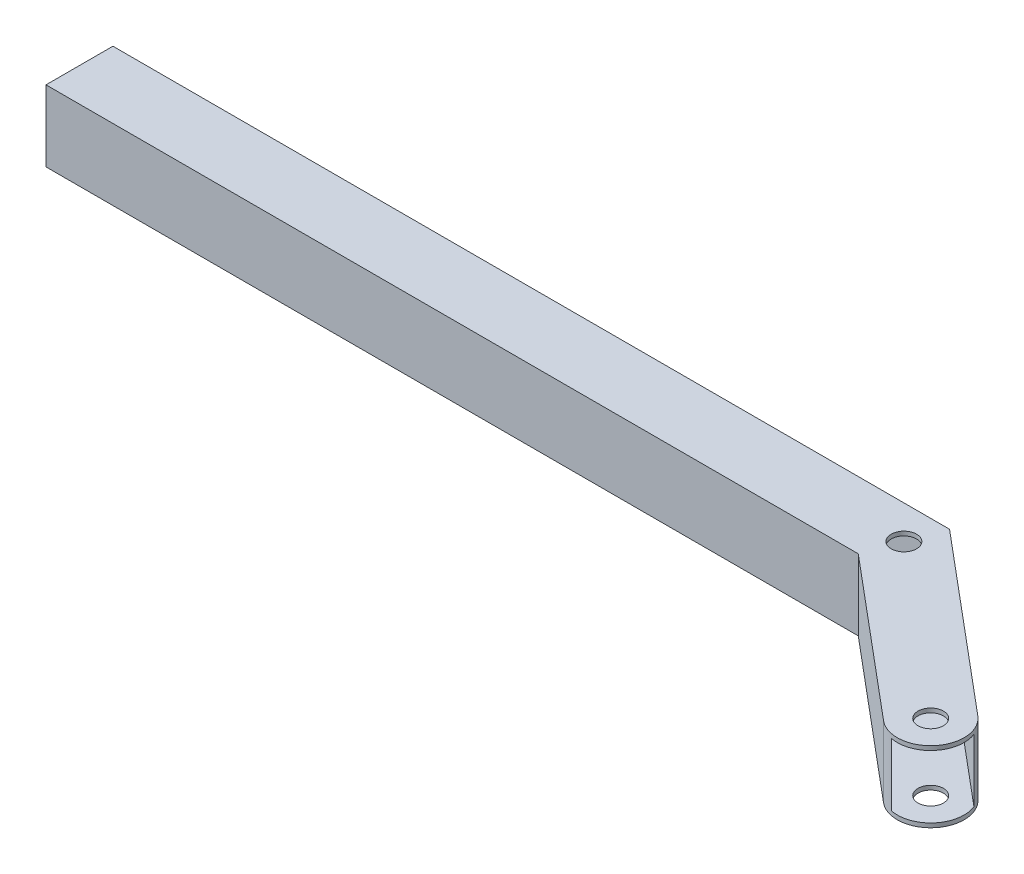
ISO-10303-21;
HEADER;
FILE_DESCRIPTION(('STEP AP214'),'2;1');
FILE_NAME('part.step','',(''),(''),'','','');
FILE_SCHEMA(('AUTOMOTIVE_DESIGN { 1 0 10303 214 1 1 1 1 }'));
ENDSEC;
DATA;
#1=APPLICATION_CONTEXT('core data for automotive mechanical design processes');
#2=APPLICATION_PROTOCOL_DEFINITION('international standard','automotive_design',2000,#1);
#3=PRODUCT_CONTEXT('',#1,'mechanical');
#4=PRODUCT('Part','Part','',(#3));
#5=PRODUCT_RELATED_PRODUCT_CATEGORY('part','',(#4));
#6=PRODUCT_DEFINITION_FORMATION('','',#4);
#7=PRODUCT_DEFINITION_CONTEXT('part definition',#1,'design');
#8=PRODUCT_DEFINITION('design','',#6,#7);
#9=PRODUCT_DEFINITION_SHAPE('','',#8);
#10=(LENGTH_UNIT() NAMED_UNIT(*) SI_UNIT(.MILLI.,.METRE.));
#11=(NAMED_UNIT(*) PLANE_ANGLE_UNIT() SI_UNIT($,.RADIAN.));
#12=(NAMED_UNIT(*) SI_UNIT($,.STERADIAN.) SOLID_ANGLE_UNIT());
#13=UNCERTAINTY_MEASURE_WITH_UNIT(LENGTH_MEASURE(1.E-05),#10,'distance_accuracy_value','');
#14=(GEOMETRIC_REPRESENTATION_CONTEXT(3) GLOBAL_UNCERTAINTY_ASSIGNED_CONTEXT((#13)) GLOBAL_UNIT_ASSIGNED_CONTEXT((#10,
#11,#12)) REPRESENTATION_CONTEXT('',''));
#15=CARTESIAN_POINT('',(0.,0.,0.));
#16=DIRECTION('',(0.,0.,1.));
#17=DIRECTION('',(1.,0.,0.));
#18=AXIS2_PLACEMENT_3D('',#15,#16,#17);
#19=CARTESIAN_POINT('',(175.75389828308,1.5875,92.7553970020009));
#20=DIRECTION('',(0.,-1.,0.));
#21=DIRECTION('',(0.,0.,-1.));
#22=AXIS2_PLACEMENT_3D('',#19,#20,#21);
#23=PLANE('',#22);
#24=CARTESIAN_POINT('',(175.75389828308,1.5875,92.7553970020009));
#25=DIRECTION('',(0.,-1.,0.));
#26=DIRECTION('',(0.,0.,-1.));
#27=AXIS2_PLACEMENT_3D('',#24,#25,#26);
#28=CIRCLE('',#27,4.82599999999999);
#29=CARTESIAN_POINT('',(175.75389828308,1.5875,87.9293970020009));
#30=VERTEX_POINT('',#29);
#31=EDGE_CURVE('E315',#30,#30,#28,.T.);
#32=ORIENTED_EDGE('',*,*,#31,.T.);
#33=EDGE_LOOP('',(#32));
#34=FACE_BOUND('',#33,.T.);
#35=CARTESIAN_POINT('',(112.516929503608,1.5875,39.6932798223774));
#36=DIRECTION('',(0.,-1.,0.));
#37=DIRECTION('',(0.,0.,-1.));
#38=AXIS2_PLACEMENT_3D('',#35,#36,#37);
#39=CIRCLE('',#38,4.82599999999999);
#40=CARTESIAN_POINT('',(112.516929503608,1.5875,34.8672798223774));
#41=VERTEX_POINT('',#40);
#42=EDGE_CURVE('E297',#41,#41,#39,.T.);
#43=ORIENTED_EDGE('',*,*,#42,.T.);
#44=EDGE_LOOP('',(#43));
#45=FACE_BOUND('',#44,.T.);
#46=DIRECTION('',(-0.766044443118982,0.,-0.642787609686534));
#47=VECTOR('',#46,1.);
#48=CARTESIAN_POINT('',(108.472310275325,1.5875,50.8057798223774));
#49=LINE('',#48,#47);
#50=CARTESIAN_POINT('',(173.320838796353,1.5875,105.22015618676));
#51=VERTEX_POINT('',#50);
#52=CARTESIAN_POINT('',(108.472310275325,1.5875,50.8057798223774));
#53=VERTEX_POINT('',#52);
#54=EDGE_CURVE('E344',#51,#53,#49,.T.);
#55=ORIENTED_EDGE('',*,*,#54,.F.);
#56=CARTESIAN_POINT('',(175.75389828308,1.5875,92.7553970020009));
#57=DIRECTION('',(0.,1.,0.));
#58=DIRECTION('',(0.,0.,-1.));
#59=AXIS2_PLACEMENT_3D('',#56,#57,#58);
#60=CIRCLE('',#59,12.7000000000001);
#61=CARTESIAN_POINT('',(187.606793421632,1.5875,88.1948184384306));
#62=VERTEX_POINT('',#61);
#63=EDGE_CURVE('E173',#51,#62,#60,.T.);
#64=ORIENTED_EDGE('',*,*,#63,.T.);
#65=DIRECTION('',(0.766044443119019,0.,0.642787609686491));
#66=VECTOR('',#65,1.);
#67=CARTESIAN_POINT('',(187.606793421639,1.5875,88.1948184384368));
#68=LINE('',#67,#66);
#69=CARTESIAN_POINT('',(117.139351478789,1.5875,29.0656138941922));
#70=VERTEX_POINT('',#69);
#71=EDGE_CURVE('E191',#70,#62,#68,.T.);
#72=ORIENTED_EDGE('',*,*,#71,.F.);
#73=DIRECTION('',(0.,0.,1.));
#74=VECTOR('',#73,1.);
#75=CARTESIAN_POINT('',(117.139351478789,1.5875,29.0656138941922));
#76=LINE('',#75,#74);
#77=CARTESIAN_POINT('',(117.139351478789,1.5875,28.5807798223774));
#78=VERTEX_POINT('',#77);
#79=EDGE_CURVE('E214',#78,#70,#76,.T.);
#80=ORIENTED_EDGE('',*,*,#79,.F.);
#81=DIRECTION('',(1.,0.,0.));
#82=VECTOR('',#81,1.);
#83=CARTESIAN_POINT('',(117.139351478789,1.5875,28.5807798223774));
#84=LINE('',#83,#82);
#85=CARTESIAN_POINT('',(116.561548731891,1.5875,28.5807798223774));
#86=VERTEX_POINT('',#85);
#87=EDGE_CURVE('E210',#86,#78,#84,.T.);
#88=ORIENTED_EDGE('',*,*,#87,.F.);
#89=DIRECTION('',(0.766044443119018,0.,0.642787609686491));
#90=VECTOR('',#89,1.);
#91=CARTESIAN_POINT('',(116.561548731891,1.5875,28.5807798223774));
#92=LINE('',#91,#90);
#93=CARTESIAN_POINT('',(116.118926148411,1.5875,28.2093753758287));
#94=VERTEX_POINT('',#93);
#95=EDGE_CURVE('E206',#94,#86,#92,.T.);
#96=ORIENTED_EDGE('',*,*,#95,.F.);
#97=DIRECTION('',(0.642787609686489,0.,-0.76604444311902));
#98=VECTOR('',#97,1.);
#99=CARTESIAN_POINT('',(116.118926148411,1.5875,28.2093753758287));
#100=LINE('',#99,#98);
#101=CARTESIAN_POINT('',(115.807280814295,1.5875,28.5807798223774));
#102=VERTEX_POINT('',#101);
#103=EDGE_CURVE('E180',#102,#94,#100,.T.);
#104=ORIENTED_EDGE('',*,*,#103,.F.);
#105=DIRECTION('',(1.,0.,0.));
#106=VECTOR('',#105,1.);
#107=CARTESIAN_POINT('',(115.807280814295,1.5875,28.5807798223774));
#108=LINE('',#107,#106);
#109=CARTESIAN_POINT('',(-200.411070496392,1.5875,28.5807798223775));
#110=VERTEX_POINT('',#109);
#111=EDGE_CURVE('E175',#110,#102,#108,.T.);
#112=ORIENTED_EDGE('',*,*,#111,.F.);
#113=DIRECTION('',(0.,0.,1.));
#114=VECTOR('',#113,1.);
#115=CARTESIAN_POINT('',(-200.411070496392,1.5875,52.3932798223774));
#116=LINE('',#115,#114);
#117=CARTESIAN_POINT('',(-200.411070496392,1.5875,50.8057798223774));
#118=VERTEX_POINT('',#117);
#119=EDGE_CURVE('E244',#110,#118,#116,.T.);
#120=ORIENTED_EDGE('',*,*,#119,.T.);
#121=DIRECTION('',(-1.,0.,0.));
#122=VECTOR('',#121,1.);
#123=CARTESIAN_POINT('',(-200.411070496392,1.5875,50.8057798223774));
#124=LINE('',#123,#122);
#125=EDGE_CURVE('E350',#53,#118,#124,.T.);
#126=ORIENTED_EDGE('',*,*,#125,.F.);
#127=EDGE_LOOP('',(#55,#64,#72,#80,#88,#96,#104,#112,#120,#126));
#128=FACE_BOUND('',#127,.T.);
#129=ADVANCED_FACE('F39',(#34,#45,#128),#23,.F.);
#130=CARTESIAN_POINT('',(175.75389828308,1.5875,92.7553970020009));
#131=DIRECTION('',(0.,-1.,0.));
#132=DIRECTION('',(0.,0.,-1.));
#133=AXIS2_PLACEMENT_3D('',#130,#131,#132);
#134=CYLINDRICAL_SURFACE('',#133,12.7000000000001);
#135=CARTESIAN_POINT('',(175.75389828308,25.4,92.7553970020008));
#136=DIRECTION('',(0.,1.,0.));
#137=DIRECTION('',(0.,0.,-1.));
#138=AXIS2_PLACEMENT_3D('',#135,#136,#137);
#139=CIRCLE('',#138,12.7000000000001);
#140=CARTESIAN_POINT('',(173.320838796353,25.4,105.22015618676));
#141=VERTEX_POINT('',#140);
#142=CARTESIAN_POINT('',(187.606793421632,25.4,88.1948184384308));
#143=VERTEX_POINT('',#142);
#144=EDGE_CURVE('E157',#141,#143,#139,.T.);
#145=ORIENTED_EDGE('',*,*,#144,.T.);
#146=DIRECTION('',(0.,-1.,0.));
#147=VECTOR('',#146,1.);
#148=CARTESIAN_POINT('',(187.606793421639,26.9875,88.1948184384368));
#149=LINE('',#148,#147);
#150=EDGE_CURVE('E201',#143,#62,#149,.T.);
#151=ORIENTED_EDGE('',*,*,#150,.T.);
#152=ORIENTED_EDGE('',*,*,#63,.F.);
#153=DIRECTION('',(0.,-1.,0.));
#154=VECTOR('',#153,1.);
#155=CARTESIAN_POINT('',(173.320838796353,26.9875,105.22015618676));
#156=LINE('',#155,#154);
#157=EDGE_CURVE('E64',#141,#51,#156,.T.);
#158=ORIENTED_EDGE('',*,*,#157,.F.);
#159=EDGE_LOOP('',(#145,#151,#152,#158));
#160=FACE_BOUND('',#159,.T.);
#161=CARTESIAN_POINT('',(175.75389828308,0.,92.7553970020009));
#162=DIRECTION('',(0.,1.,0.));
#163=DIRECTION('',(0.,0.,-1.));
#164=AXIS2_PLACEMENT_3D('',#161,#162,#163);
#165=CIRCLE('',#164,12.7000000000001);
#166=CARTESIAN_POINT('',(167.590495640061,0.,102.484161429612));
#167=VERTEX_POINT('',#166);
#168=CARTESIAN_POINT('',(183.917300926099,0.,83.0266325743897));
#169=VERTEX_POINT('',#168);
#170=EDGE_CURVE('E241',#167,#169,#165,.T.);
#171=ORIENTED_EDGE('',*,*,#170,.T.);
#172=DIRECTION('',(0.,-1.,0.));
#173=VECTOR('',#172,1.);
#174=CARTESIAN_POINT('',(183.917300926099,1.5875,83.0266325743897));
#175=LINE('',#174,#173);
#176=CARTESIAN_POINT('',(183.917300926102,26.9875,83.026632574386));
#177=VERTEX_POINT('',#176);
#178=EDGE_CURVE('E49',#177,#169,#175,.T.);
#179=ORIENTED_EDGE('',*,*,#178,.F.);
#180=CARTESIAN_POINT('',(175.753898283083,26.9875,92.755397001998));
#181=DIRECTION('',(0.,1.,0.));
#182=DIRECTION('',(0.,0.,-1.));
#183=AXIS2_PLACEMENT_3D('',#180,#181,#182);
#184=CIRCLE('',#183,12.7000000000007);
#185=CARTESIAN_POINT('',(167.590495640061,26.9875,102.484161429612));
#186=VERTEX_POINT('',#185);
#187=EDGE_CURVE('E186',#186,#177,#184,.T.);
#188=ORIENTED_EDGE('',*,*,#187,.F.);
#189=DIRECTION('',(0.,-1.,0.));
#190=VECTOR('',#189,1.);
#191=CARTESIAN_POINT('',(167.590495640061,1.5875,102.484161429612));
#192=LINE('',#191,#190);
#193=EDGE_CURVE('E249',#186,#167,#192,.T.);
#194=ORIENTED_EDGE('',*,*,#193,.T.);
#195=EDGE_LOOP('',(#171,#179,#188,#194));
#196=FACE_BOUND('',#195,.T.);
#197=ADVANCED_FACE('F41',(#160,#196),#134,.T.);
#198=CARTESIAN_POINT('',(117.139351478789,1.5875,26.9932798223774));
#199=DIRECTION('',(-0.642787609686534,0.,0.766044443118982));
#200=DIRECTION('',(0.766044443118983,0.,0.642787609686534));
#201=AXIS2_PLACEMENT_3D('',#198,#199,#200);
#202=PLANE('',#201);
#203=DIRECTION('',(-0.766044443118983,0.,-0.642787609686534));
#204=VECTOR('',#203,1.);
#205=CARTESIAN_POINT('',(117.139351478789,0.,26.9932798223774));
#206=LINE('',#205,#204);
#207=CARTESIAN_POINT('',(117.139351478789,0.,26.9932798223774));
#208=VERTEX_POINT('',#207);
#209=EDGE_CURVE('E253',#169,#208,#206,.T.);
#210=ORIENTED_EDGE('',*,*,#209,.T.);
#211=DIRECTION('',(0.,-1.,0.));
#212=VECTOR('',#211,1.);
#213=CARTESIAN_POINT('',(117.139351478789,1.5875,26.9932798223774));
#214=LINE('',#213,#212);
#215=CARTESIAN_POINT('',(117.139351478789,26.9875,26.9932798223774));
#216=VERTEX_POINT('',#215);
#217=EDGE_CURVE('E283',#216,#208,#214,.T.);
#218=ORIENTED_EDGE('',*,*,#217,.F.);
#219=DIRECTION('',(-0.766044443119019,0.,-0.642787609686491));
#220=VECTOR('',#219,1.);
#221=CARTESIAN_POINT('',(117.139351478789,26.9875,26.9932798223774));
#222=LINE('',#221,#220);
#223=EDGE_CURVE('E190',#177,#216,#222,.T.);
#224=ORIENTED_EDGE('',*,*,#223,.F.);
#225=ORIENTED_EDGE('',*,*,#178,.T.);
#226=EDGE_LOOP('',(#210,#218,#224,#225));
#227=FACE_BOUND('',#226,.T.);
#228=ADVANCED_FACE('F385',(#227),#202,.F.);
#229=CARTESIAN_POINT('',(-200.411070496392,1.5875,26.9932798223774));
#230=DIRECTION('',(0.,0.,1.));
#231=DIRECTION('',(1.,0.,0.));
#232=AXIS2_PLACEMENT_3D('',#229,#230,#231);
#233=PLANE('',#232);
#234=DIRECTION('',(-1.,0.,0.));
#235=VECTOR('',#234,1.);
#236=CARTESIAN_POINT('',(-200.411070496392,0.,26.9932798223774));
#237=LINE('',#236,#235);
#238=CARTESIAN_POINT('',(-200.411070496392,0.,26.9932798223774));
#239=VERTEX_POINT('',#238);
#240=EDGE_CURVE('E257',#208,#239,#237,.T.);
#241=ORIENTED_EDGE('',*,*,#240,.T.);
#242=DIRECTION('',(0.,-1.,0.));
#243=VECTOR('',#242,1.);
#244=CARTESIAN_POINT('',(-200.411070496392,1.5875,26.9932798223774));
#245=LINE('',#244,#243);
#246=CARTESIAN_POINT('',(-200.411070496392,26.9875,26.9932798223774));
#247=VERTEX_POINT('',#246);
#248=EDGE_CURVE('E280',#247,#239,#245,.T.);
#249=ORIENTED_EDGE('',*,*,#248,.F.);
#250=DIRECTION('',(-1.,0.,0.));
#251=VECTOR('',#250,1.);
#252=CARTESIAN_POINT('',(-200.411070496392,26.9875,26.9932798223774));
#253=LINE('',#252,#251);
#254=EDGE_CURVE('E195',#216,#247,#253,.T.);
#255=ORIENTED_EDGE('',*,*,#254,.F.);
#256=ORIENTED_EDGE('',*,*,#217,.T.);
#257=EDGE_LOOP('',(#241,#249,#255,#256));
#258=FACE_BOUND('',#257,.T.);
#259=ADVANCED_FACE('F405',(#258),#233,.F.);
#260=CARTESIAN_POINT('',(-200.411070496392,1.5875,52.3932798223774));
#261=DIRECTION('',(1.,0.,0.));
#262=DIRECTION('',(0.,0.,-1.));
#263=AXIS2_PLACEMENT_3D('',#260,#261,#262);
#264=PLANE('',#263);
#265=DIRECTION('',(0.,0.,1.));
#266=VECTOR('',#265,1.);
#267=CARTESIAN_POINT('',(-200.411070496392,25.4,26.9932798223774));
#268=LINE('',#267,#266);
#269=CARTESIAN_POINT('',(-200.411070496392,25.4,28.5807798223775));
#270=VERTEX_POINT('',#269);
#271=CARTESIAN_POINT('',(-200.411070496392,25.4,50.8057798223774));
#272=VERTEX_POINT('',#271);
#273=EDGE_CURVE('E165',#270,#272,#268,.T.);
#274=ORIENTED_EDGE('',*,*,#273,.T.);
#275=DIRECTION('',(0.,-1.,0.));
#276=VECTOR('',#275,1.);
#277=CARTESIAN_POINT('',(-200.411070496392,26.9875,50.8057798223774));
#278=LINE('',#277,#276);
#279=EDGE_CURVE('E182',#272,#118,#278,.T.);
#280=ORIENTED_EDGE('',*,*,#279,.T.);
#281=ORIENTED_EDGE('',*,*,#119,.F.);
#282=DIRECTION('',(0.,-1.,0.));
#283=VECTOR('',#282,1.);
#284=CARTESIAN_POINT('',(-200.411070496392,26.9875,28.5807798223775));
#285=LINE('',#284,#283);
#286=EDGE_CURVE('E238',#270,#110,#285,.T.);
#287=ORIENTED_EDGE('',*,*,#286,.F.);
#288=EDGE_LOOP('',(#274,#280,#281,#287));
#289=FACE_BOUND('',#288,.T.);
#290=DIRECTION('',(0.,0.,1.));
#291=VECTOR('',#290,1.);
#292=CARTESIAN_POINT('',(-200.411070496392,0.,52.3932798223774));
#293=LINE('',#292,#291);
#294=CARTESIAN_POINT('',(-200.411070496392,0.,52.3932798223774));
#295=VERTEX_POINT('',#294);
#296=EDGE_CURVE('E261',#239,#295,#293,.T.);
#297=ORIENTED_EDGE('',*,*,#296,.T.);
#298=DIRECTION('',(0.,-1.,0.));
#299=VECTOR('',#298,1.);
#300=CARTESIAN_POINT('',(-200.411070496392,1.5875,52.3932798223774));
#301=LINE('',#300,#299);
#302=CARTESIAN_POINT('',(-200.411070496392,26.9875,52.3932798223774));
#303=VERTEX_POINT('',#302);
#304=EDGE_CURVE('E277',#303,#295,#301,.T.);
#305=ORIENTED_EDGE('',*,*,#304,.F.);
#306=DIRECTION('',(0.,0.,1.));
#307=VECTOR('',#306,1.);
#308=CARTESIAN_POINT('',(-200.411070496392,26.9875,28.5807798223775));
#309=LINE('',#308,#307);
#310=EDGE_CURVE('E199',#247,#303,#309,.T.);
#311=ORIENTED_EDGE('',*,*,#310,.F.);
#312=ORIENTED_EDGE('',*,*,#248,.T.);
#313=EDGE_LOOP('',(#297,#305,#311,#312));
#314=FACE_BOUND('',#313,.T.);
#315=ADVANCED_FACE('F361',(#289,#314),#264,.F.);
#316=CARTESIAN_POINT('',(107.894507528427,1.5875,52.3932798223774));
#317=DIRECTION('',(0.,0.,-1.));
#318=DIRECTION('',(-1.,0.,0.));
#319=AXIS2_PLACEMENT_3D('',#316,#317,#318);
#320=PLANE('',#319);
#321=DIRECTION('',(1.,0.,0.));
#322=VECTOR('',#321,1.);
#323=CARTESIAN_POINT('',(107.894507528427,0.,52.3932798223774));
#324=LINE('',#323,#322);
#325=CARTESIAN_POINT('',(107.894507528427,0.,52.3932798223774));
#326=VERTEX_POINT('',#325);
#327=EDGE_CURVE('E265',#295,#326,#324,.T.);
#328=ORIENTED_EDGE('',*,*,#327,.T.);
#329=DIRECTION('',(0.,-1.,0.));
#330=VECTOR('',#329,1.);
#331=CARTESIAN_POINT('',(107.894507528427,1.5875,52.3932798223774));
#332=LINE('',#331,#330);
#333=CARTESIAN_POINT('',(107.894507528427,26.9875,52.3932798223774));
#334=VERTEX_POINT('',#333);
#335=EDGE_CURVE('E274',#334,#326,#332,.T.);
#336=ORIENTED_EDGE('',*,*,#335,.F.);
#337=DIRECTION('',(1.,0.,0.));
#338=VECTOR('',#337,1.);
#339=CARTESIAN_POINT('',(107.894507528427,26.9875,52.3932798223774));
#340=LINE('',#339,#338);
#341=EDGE_CURVE('E345',#303,#334,#340,.T.);
#342=ORIENTED_EDGE('',*,*,#341,.F.);
#343=ORIENTED_EDGE('',*,*,#304,.T.);
#344=EDGE_LOOP('',(#328,#336,#342,#343));
#345=FACE_BOUND('',#344,.T.);
#346=ADVANCED_FACE('F398',(#345),#320,.F.);
#347=CARTESIAN_POINT('',(167.590495640061,1.5875,102.484161429612));
#348=DIRECTION('',(0.642787609686536,0.,-0.766044443118981));
#349=DIRECTION('',(-0.766044443118981,0.,-0.642787609686536));
#350=AXIS2_PLACEMENT_3D('',#347,#348,#349);
#351=PLANE('',#350);
#352=DIRECTION('',(0.766044443118981,0.,0.642787609686536));
#353=VECTOR('',#352,1.);
#354=CARTESIAN_POINT('',(167.590495640061,0.,102.484161429612));
#355=LINE('',#354,#353);
#356=EDGE_CURVE('E245',#326,#167,#355,.T.);
#357=ORIENTED_EDGE('',*,*,#356,.T.);
#358=ORIENTED_EDGE('',*,*,#193,.F.);
#359=DIRECTION('',(0.766044443118981,0.,0.642787609686535));
#360=VECTOR('',#359,1.);
#361=CARTESIAN_POINT('',(167.590495640061,26.9875,102.484161429612));
#362=LINE('',#361,#360);
#363=EDGE_CURVE('E349',#334,#186,#362,.T.);
#364=ORIENTED_EDGE('',*,*,#363,.F.);
#365=ORIENTED_EDGE('',*,*,#335,.T.);
#366=EDGE_LOOP('',(#357,#358,#364,#365));
#367=FACE_BOUND('',#366,.T.);
#368=ADVANCED_FACE('F394',(#367),#351,.F.);
#369=CARTESIAN_POINT('',(175.75389828308,0.,92.7553970020009));
#370=DIRECTION('',(0.,-1.,0.));
#371=DIRECTION('',(0.,0.,-1.));
#372=AXIS2_PLACEMENT_3D('',#369,#370,#371);
#373=PLANE('',#372);
#374=CARTESIAN_POINT('',(175.75389828308,0.,92.7553970020009));
#375=DIRECTION('',(0.,-1.,0.));
#376=DIRECTION('',(0.,0.,-1.));
#377=AXIS2_PLACEMENT_3D('',#374,#375,#376);
#378=CIRCLE('',#377,4.82599999999999);
#379=CARTESIAN_POINT('',(175.75389828308,0.,87.9293970020009));
#380=VERTEX_POINT('',#379);
#381=EDGE_CURVE('E311',#380,#380,#378,.T.);
#382=ORIENTED_EDGE('',*,*,#381,.F.);
#383=EDGE_LOOP('',(#382));
#384=FACE_BOUND('',#383,.T.);
#385=CARTESIAN_POINT('',(112.516929503608,0.,39.6932798223774));
#386=DIRECTION('',(0.,-1.,0.));
#387=DIRECTION('',(0.,0.,-1.));
#388=AXIS2_PLACEMENT_3D('',#385,#386,#387);
#389=CIRCLE('',#388,4.82599999999999);
#390=CARTESIAN_POINT('',(112.516929503608,0.,34.8672798223774));
#391=VERTEX_POINT('',#390);
#392=EDGE_CURVE('E290',#391,#391,#389,.T.);
#393=ORIENTED_EDGE('',*,*,#392,.F.);
#394=EDGE_LOOP('',(#393));
#395=FACE_BOUND('',#394,.T.);
#396=ORIENTED_EDGE('',*,*,#170,.F.);
#397=ORIENTED_EDGE('',*,*,#356,.F.);
#398=ORIENTED_EDGE('',*,*,#327,.F.);
#399=ORIENTED_EDGE('',*,*,#296,.F.);
#400=ORIENTED_EDGE('',*,*,#240,.F.);
#401=ORIENTED_EDGE('',*,*,#209,.F.);
#402=EDGE_LOOP('',(#396,#397,#398,#399,#400,#401));
#403=FACE_BOUND('',#402,.T.);
#404=ADVANCED_FACE('F391',(#384,#395,#403),#373,.T.);
#405=CARTESIAN_POINT('',(115.807280814295,26.9875,28.5807798223774));
#406=DIRECTION('',(0.,0.,-1.));
#407=DIRECTION('',(-1.,0.,0.));
#408=AXIS2_PLACEMENT_3D('',#405,#406,#407);
#409=PLANE('',#408);
#410=DIRECTION('',(0.,-1.,0.));
#411=VECTOR('',#410,1.);
#412=CARTESIAN_POINT('',(115.807280814295,26.9875,28.5807798223774));
#413=LINE('',#412,#411);
#414=CARTESIAN_POINT('',(115.807280814295,25.4,28.5807798223774));
#415=VERTEX_POINT('',#414);
#416=EDGE_CURVE('E235',#415,#102,#413,.T.);
#417=ORIENTED_EDGE('',*,*,#416,.F.);
#418=DIRECTION('',(-1.,0.,0.));
#419=VECTOR('',#418,1.);
#420=CARTESIAN_POINT('',(115.807280814295,25.4,28.5807798223774));
#421=LINE('',#420,#419);
#422=EDGE_CURVE('E340',#415,#270,#421,.T.);
#423=ORIENTED_EDGE('',*,*,#422,.T.);
#424=ORIENTED_EDGE('',*,*,#286,.T.);
#425=ORIENTED_EDGE('',*,*,#111,.T.);
#426=EDGE_LOOP('',(#417,#423,#424,#425));
#427=FACE_BOUND('',#426,.T.);
#428=ADVANCED_FACE('F389',(#427),#409,.F.);
#429=CARTESIAN_POINT('',(116.118926148411,26.9875,28.2093753758287));
#430=DIRECTION('',(-0.76604444311902,0.,-0.642787609686489));
#431=DIRECTION('',(-0.64278760968649,0.,0.76604444311902));
#432=AXIS2_PLACEMENT_3D('',#429,#430,#431);
#433=PLANE('',#432);
#434=DIRECTION('',(0.,-1.,0.));
#435=VECTOR('',#434,1.);
#436=CARTESIAN_POINT('',(116.118926148411,26.9875,28.2093753758287));
#437=LINE('',#436,#435);
#438=CARTESIAN_POINT('',(116.118926148411,25.4,28.2093753758287));
#439=VERTEX_POINT('',#438);
#440=EDGE_CURVE('E232',#439,#94,#437,.T.);
#441=ORIENTED_EDGE('',*,*,#440,.F.);
#442=DIRECTION('',(-0.64278760968649,0.,0.76604444311902));
#443=VECTOR('',#442,1.);
#444=CARTESIAN_POINT('',(116.118926148411,25.4,28.2093753758287));
#445=LINE('',#444,#443);
#446=EDGE_CURVE('E336',#439,#415,#445,.T.);
#447=ORIENTED_EDGE('',*,*,#446,.T.);
#448=ORIENTED_EDGE('',*,*,#416,.T.);
#449=ORIENTED_EDGE('',*,*,#103,.T.);
#450=EDGE_LOOP('',(#441,#447,#448,#449));
#451=FACE_BOUND('',#450,.T.);
#452=ADVANCED_FACE('F448',(#451),#433,.F.);
#453=CARTESIAN_POINT('',(116.561548731891,26.9875,28.5807798223774));
#454=DIRECTION('',(0.642787609686491,0.,-0.766044443119019));
#455=DIRECTION('',(-0.766044443119019,0.,-0.642787609686491));
#456=AXIS2_PLACEMENT_3D('',#453,#454,#455);
#457=PLANE('',#456);
#458=DIRECTION('',(0.,-1.,0.));
#459=VECTOR('',#458,1.);
#460=CARTESIAN_POINT('',(116.561548731891,26.9875,28.5807798223774));
#461=LINE('',#460,#459);
#462=CARTESIAN_POINT('',(116.561548731891,25.4,28.5807798223774));
#463=VERTEX_POINT('',#462);
#464=EDGE_CURVE('E229',#463,#86,#461,.T.);
#465=ORIENTED_EDGE('',*,*,#464,.F.);
#466=DIRECTION('',(-0.766044443119019,0.,-0.642787609686491));
#467=VECTOR('',#466,1.);
#468=CARTESIAN_POINT('',(116.561548731891,25.4,28.5807798223774));
#469=LINE('',#468,#467);
#470=EDGE_CURVE('E332',#463,#439,#469,.T.);
#471=ORIENTED_EDGE('',*,*,#470,.T.);
#472=ORIENTED_EDGE('',*,*,#440,.T.);
#473=ORIENTED_EDGE('',*,*,#95,.T.);
#474=EDGE_LOOP('',(#465,#471,#472,#473));
#475=FACE_BOUND('',#474,.T.);
#476=ADVANCED_FACE('F445',(#475),#457,.F.);
#477=CARTESIAN_POINT('',(117.139351478789,26.9875,28.5807798223774));
#478=DIRECTION('',(0.,0.,-1.));
#479=DIRECTION('',(-1.,0.,0.));
#480=AXIS2_PLACEMENT_3D('',#477,#478,#479);
#481=PLANE('',#480);
#482=DIRECTION('',(0.,-1.,0.));
#483=VECTOR('',#482,1.);
#484=CARTESIAN_POINT('',(117.139351478789,26.9875,28.5807798223774));
#485=LINE('',#484,#483);
#486=CARTESIAN_POINT('',(117.139351478789,25.4,28.5807798223774));
#487=VERTEX_POINT('',#486);
#488=EDGE_CURVE('E226',#487,#78,#485,.T.);
#489=ORIENTED_EDGE('',*,*,#488,.F.);
#490=DIRECTION('',(-1.,0.,0.));
#491=VECTOR('',#490,1.);
#492=CARTESIAN_POINT('',(117.139351478789,25.4,28.5807798223774));
#493=LINE('',#492,#491);
#494=EDGE_CURVE('E328',#487,#463,#493,.T.);
#495=ORIENTED_EDGE('',*,*,#494,.T.);
#496=ORIENTED_EDGE('',*,*,#464,.T.);
#497=ORIENTED_EDGE('',*,*,#87,.T.);
#498=EDGE_LOOP('',(#489,#495,#496,#497));
#499=FACE_BOUND('',#498,.T.);
#500=ADVANCED_FACE('F441',(#499),#481,.F.);
#501=CARTESIAN_POINT('',(117.139351478789,26.9875,29.0656138941922));
#502=DIRECTION('',(1.,0.,0.));
#503=DIRECTION('',(0.,0.,-1.));
#504=AXIS2_PLACEMENT_3D('',#501,#502,#503);
#505=PLANE('',#504);
#506=DIRECTION('',(0.,-1.,0.));
#507=VECTOR('',#506,1.);
#508=CARTESIAN_POINT('',(117.139351478789,26.9875,29.0656138941922));
#509=LINE('',#508,#507);
#510=CARTESIAN_POINT('',(117.139351478789,25.4,29.0656138941922));
#511=VERTEX_POINT('',#510);
#512=EDGE_CURVE('E223',#511,#70,#509,.T.);
#513=ORIENTED_EDGE('',*,*,#512,.F.);
#514=DIRECTION('',(0.,0.,-1.));
#515=VECTOR('',#514,1.);
#516=CARTESIAN_POINT('',(117.139351478789,25.4,29.0656138941922));
#517=LINE('',#516,#515);
#518=EDGE_CURVE('E324',#511,#487,#517,.T.);
#519=ORIENTED_EDGE('',*,*,#518,.T.);
#520=ORIENTED_EDGE('',*,*,#488,.T.);
#521=ORIENTED_EDGE('',*,*,#79,.T.);
#522=EDGE_LOOP('',(#513,#519,#520,#521));
#523=FACE_BOUND('',#522,.T.);
#524=ADVANCED_FACE('F434',(#523),#505,.F.);
#525=CARTESIAN_POINT('',(187.606793421639,26.9875,88.1948184384368));
#526=DIRECTION('',(0.642787609686491,0.,-0.766044443119019));
#527=DIRECTION('',(-0.766044443119019,0.,-0.642787609686491));
#528=AXIS2_PLACEMENT_3D('',#525,#526,#527);
#529=PLANE('',#528);
#530=ORIENTED_EDGE('',*,*,#150,.F.);
#531=DIRECTION('',(-0.766044443119019,0.,-0.642787609686491));
#532=VECTOR('',#531,1.);
#533=CARTESIAN_POINT('',(187.606793421639,25.4,88.1948184384368));
#534=LINE('',#533,#532);
#535=EDGE_CURVE('E161',#143,#511,#534,.T.);
#536=ORIENTED_EDGE('',*,*,#535,.T.);
#537=ORIENTED_EDGE('',*,*,#512,.T.);
#538=ORIENTED_EDGE('',*,*,#71,.T.);
#539=EDGE_LOOP('',(#530,#536,#537,#538));
#540=FACE_BOUND('',#539,.T.);
#541=ADVANCED_FACE('F428',(#540),#529,.F.);
#542=CARTESIAN_POINT('',(175.753898283083,26.9875,92.755397001998));
#543=DIRECTION('',(0.,-1.,0.));
#544=DIRECTION('',(0.,0.,-1.));
#545=AXIS2_PLACEMENT_3D('',#542,#543,#544);
#546=PLANE('',#545);
#547=CARTESIAN_POINT('',(175.75389828308,26.9875,92.7553970020009));
#548=DIRECTION('',(0.,1.,0.));
#549=DIRECTION('',(0.,0.,1.));
#550=AXIS2_PLACEMENT_3D('',#547,#548,#549);
#551=CIRCLE('',#550,4.82599999999999);
#552=CARTESIAN_POINT('',(175.75389828308,26.9875,97.5813970020008));
#553=VERTEX_POINT('',#552);
#554=EDGE_CURVE('E291',#553,#553,#551,.T.);
#555=ORIENTED_EDGE('',*,*,#554,.F.);
#556=EDGE_LOOP('',(#555));
#557=FACE_BOUND('',#556,.T.);
#558=CARTESIAN_POINT('',(112.516929503608,26.9875,39.6932798223774));
#559=DIRECTION('',(0.,1.,0.));
#560=DIRECTION('',(0.,0.,1.));
#561=AXIS2_PLACEMENT_3D('',#558,#559,#560);
#562=CIRCLE('',#561,4.82599999999999);
#563=CARTESIAN_POINT('',(112.516929503608,26.9875,44.5192798223774));
#564=VERTEX_POINT('',#563);
#565=EDGE_CURVE('E300',#564,#564,#562,.T.);
#566=ORIENTED_EDGE('',*,*,#565,.F.);
#567=EDGE_LOOP('',(#566));
#568=FACE_BOUND('',#567,.T.);
#569=ORIENTED_EDGE('',*,*,#187,.T.);
#570=ORIENTED_EDGE('',*,*,#223,.T.);
#571=ORIENTED_EDGE('',*,*,#254,.T.);
#572=ORIENTED_EDGE('',*,*,#310,.T.);
#573=ORIENTED_EDGE('',*,*,#341,.T.);
#574=ORIENTED_EDGE('',*,*,#363,.T.);
#575=EDGE_LOOP('',(#569,#570,#571,#572,#573,#574));
#576=FACE_BOUND('',#575,.T.);
#577=ADVANCED_FACE('F377',(#557,#568,#576),#546,.F.);
#578=CARTESIAN_POINT('',(108.472310275325,26.9875,50.8057798223774));
#579=DIRECTION('',(-0.642787609686534,0.,0.766044443118982));
#580=DIRECTION('',(0.766044443118982,0.,0.642787609686534));
#581=AXIS2_PLACEMENT_3D('',#578,#579,#580);
#582=PLANE('',#581);
#583=DIRECTION('',(0.,-1.,0.));
#584=VECTOR('',#583,1.);
#585=CARTESIAN_POINT('',(108.472310275325,26.9875,50.8057798223774));
#586=LINE('',#585,#584);
#587=CARTESIAN_POINT('',(108.472310275325,25.4,50.8057798223774));
#588=VERTEX_POINT('',#587);
#589=EDGE_CURVE('E56',#588,#53,#586,.T.);
#590=ORIENTED_EDGE('',*,*,#589,.F.);
#591=DIRECTION('',(0.766044443118982,0.,0.642787609686534));
#592=VECTOR('',#591,1.);
#593=CARTESIAN_POINT('',(108.472310275325,25.4,50.8057798223774));
#594=LINE('',#593,#592);
#595=EDGE_CURVE('E159',#588,#141,#594,.T.);
#596=ORIENTED_EDGE('',*,*,#595,.T.);
#597=ORIENTED_EDGE('',*,*,#157,.T.);
#598=ORIENTED_EDGE('',*,*,#54,.T.);
#599=EDGE_LOOP('',(#590,#596,#597,#598));
#600=FACE_BOUND('',#599,.T.);
#601=ADVANCED_FACE('F167',(#600),#582,.F.);
#602=CARTESIAN_POINT('',(-200.411070496392,26.9875,50.8057798223774));
#603=DIRECTION('',(0.,0.,1.));
#604=DIRECTION('',(1.,0.,0.));
#605=AXIS2_PLACEMENT_3D('',#602,#603,#604);
#606=PLANE('',#605);
#607=ORIENTED_EDGE('',*,*,#279,.F.);
#608=DIRECTION('',(1.,0.,0.));
#609=VECTOR('',#608,1.);
#610=CARTESIAN_POINT('',(-200.411070496392,25.4,50.8057798223774));
#611=LINE('',#610,#609);
#612=EDGE_CURVE('E11',#272,#588,#611,.T.);
#613=ORIENTED_EDGE('',*,*,#612,.T.);
#614=ORIENTED_EDGE('',*,*,#589,.T.);
#615=ORIENTED_EDGE('',*,*,#125,.T.);
#616=EDGE_LOOP('',(#607,#613,#614,#615));
#617=FACE_BOUND('',#616,.T.);
#618=ADVANCED_FACE('F367',(#617),#606,.F.);
#619=CARTESIAN_POINT('',(175.75389828308,25.4,92.7553970020008));
#620=DIRECTION('',(0.,-1.,0.));
#621=DIRECTION('',(0.,0.,-1.));
#622=AXIS2_PLACEMENT_3D('',#619,#620,#621);
#623=PLANE('',#622);
#624=CARTESIAN_POINT('',(175.75389828308,25.4,92.7553970020009));
#625=DIRECTION('',(0.,-1.,0.));
#626=DIRECTION('',(0.,0.,-1.));
#627=AXIS2_PLACEMENT_3D('',#624,#625,#626);
#628=CIRCLE('',#627,4.82599999999999);
#629=CARTESIAN_POINT('',(175.75389828308,25.4,87.9293970020009));
#630=VERTEX_POINT('',#629);
#631=EDGE_CURVE('E43',#630,#630,#628,.T.);
#632=ORIENTED_EDGE('',*,*,#631,.F.);
#633=EDGE_LOOP('',(#632));
#634=FACE_BOUND('',#633,.T.);
#635=CARTESIAN_POINT('',(112.516929503608,25.4,39.6932798223774));
#636=DIRECTION('',(0.,-1.,0.));
#637=DIRECTION('',(0.,0.,-1.));
#638=AXIS2_PLACEMENT_3D('',#635,#636,#637);
#639=CIRCLE('',#638,4.82599999999999);
#640=CARTESIAN_POINT('',(112.516929503608,25.4,34.8672798223774));
#641=VERTEX_POINT('',#640);
#642=EDGE_CURVE('E287',#641,#641,#639,.T.);
#643=ORIENTED_EDGE('',*,*,#642,.F.);
#644=EDGE_LOOP('',(#643));
#645=FACE_BOUND('',#644,.T.);
#646=ORIENTED_EDGE('',*,*,#422,.F.);
#647=ORIENTED_EDGE('',*,*,#446,.F.);
#648=ORIENTED_EDGE('',*,*,#470,.F.);
#649=ORIENTED_EDGE('',*,*,#494,.F.);
#650=ORIENTED_EDGE('',*,*,#518,.F.);
#651=ORIENTED_EDGE('',*,*,#535,.F.);
#652=ORIENTED_EDGE('',*,*,#144,.F.);
#653=ORIENTED_EDGE('',*,*,#595,.F.);
#654=ORIENTED_EDGE('',*,*,#612,.F.);
#655=ORIENTED_EDGE('',*,*,#273,.F.);
#656=EDGE_LOOP('',(#646,#647,#648,#649,#650,#651,#652,#653,#654,#655));
#657=FACE_BOUND('',#656,.T.);
#658=ADVANCED_FACE('F158',(#634,#645,#657),#623,.T.);
#659=CARTESIAN_POINT('',(112.516929503608,-18.288,39.6932798223774));
#660=DIRECTION('',(0.,1.,0.));
#661=DIRECTION('',(0.,0.,1.));
#662=AXIS2_PLACEMENT_3D('',#659,#660,#661);
#663=CYLINDRICAL_SURFACE('',#662,4.82599999999999);
#664=ORIENTED_EDGE('',*,*,#642,.T.);
#665=EDGE_LOOP('',(#664));
#666=FACE_BOUND('',#665,.T.);
#667=ORIENTED_EDGE('',*,*,#565,.T.);
#668=EDGE_LOOP('',(#667));
#669=FACE_BOUND('',#668,.T.);
#670=ADVANCED_FACE('F374',(#666,#669),#663,.F.);
#671=CARTESIAN_POINT('',(175.75389828308,-18.288,92.7553970020009));
#672=DIRECTION('',(0.,1.,0.));
#673=DIRECTION('',(0.,0.,1.));
#674=AXIS2_PLACEMENT_3D('',#671,#672,#673);
#675=CYLINDRICAL_SURFACE('',#674,4.82599999999999);
#676=ORIENTED_EDGE('',*,*,#631,.T.);
#677=EDGE_LOOP('',(#676));
#678=FACE_BOUND('',#677,.T.);
#679=ORIENTED_EDGE('',*,*,#554,.T.);
#680=EDGE_LOOP('',(#679));
#681=FACE_BOUND('',#680,.T.);
#682=ADVANCED_FACE('F533',(#678,#681),#675,.F.);
#683=ORIENTED_EDGE('',*,*,#392,.T.);
#684=EDGE_LOOP('',(#683));
#685=FACE_BOUND('',#684,.T.);
#686=ORIENTED_EDGE('',*,*,#42,.F.);
#687=EDGE_LOOP('',(#686));
#688=FACE_BOUND('',#687,.T.);
#689=ADVANCED_FACE('F535',(#685,#688),#663,.F.);
#690=ORIENTED_EDGE('',*,*,#381,.T.);
#691=EDGE_LOOP('',(#690));
#692=FACE_BOUND('',#691,.T.);
#693=ORIENTED_EDGE('',*,*,#31,.F.);
#694=EDGE_LOOP('',(#693));
#695=FACE_BOUND('',#694,.T.);
#696=ADVANCED_FACE('F544',(#692,#695),#675,.F.);
#697=CLOSED_SHELL('',(#129,#197,#228,#259,#315,#346,#368,#404,#428,#452,#476,#500,#524,#541,
#577,#601,#618,#658,#670,#682,#689,#696));
#698=MANIFOLD_SOLID_BREP('B2',#697);
#699=ADVANCED_BREP_SHAPE_REPRESENTATION('',(#18,#698),#14);
#700=SHAPE_DEFINITION_REPRESENTATION(#9,#699);
ENDSEC;
END-ISO-10303-21;
